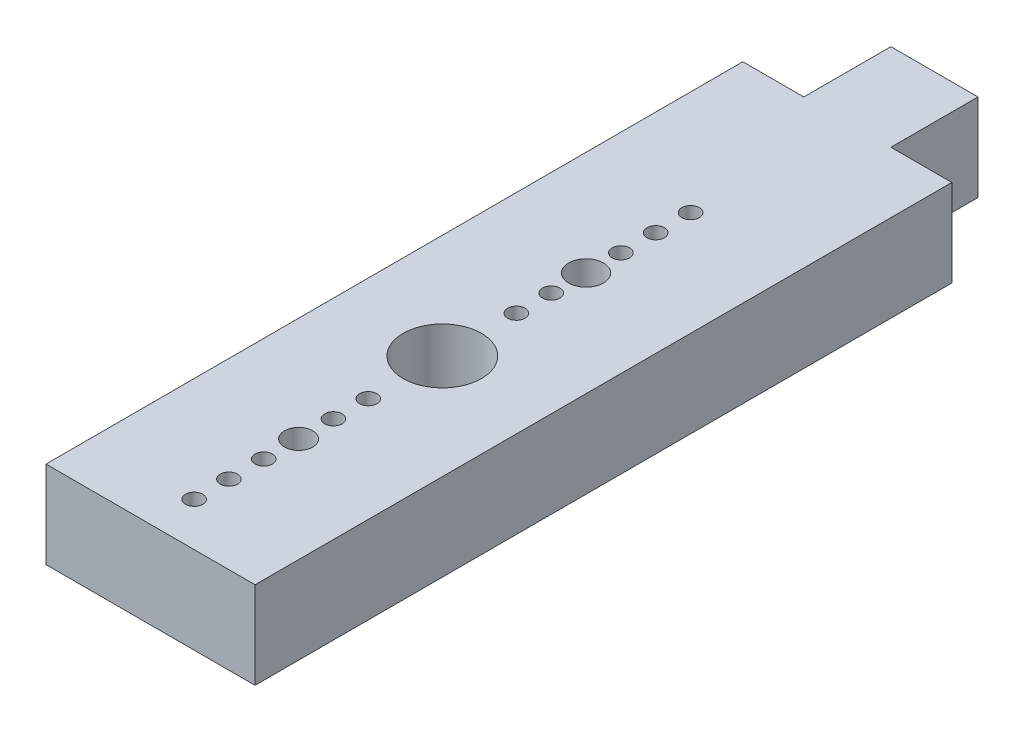
ISO-10303-21;
HEADER;
FILE_DESCRIPTION(('STEP AP214'),'2;1');
FILE_NAME('part.step','',(''),(''),'','','');
FILE_SCHEMA(('AUTOMOTIVE_DESIGN { 1 0 10303 214 1 1 1 1 }'));
ENDSEC;
DATA;
#1=APPLICATION_CONTEXT('core data for automotive mechanical design processes');
#2=APPLICATION_PROTOCOL_DEFINITION('international standard','automotive_design',2000,#1);
#3=PRODUCT_CONTEXT('',#1,'mechanical');
#4=PRODUCT('Part','Part','',(#3));
#5=PRODUCT_RELATED_PRODUCT_CATEGORY('part','',(#4));
#6=PRODUCT_DEFINITION_FORMATION('','',#4);
#7=PRODUCT_DEFINITION_CONTEXT('part definition',#1,'design');
#8=PRODUCT_DEFINITION('design','',#6,#7);
#9=PRODUCT_DEFINITION_SHAPE('','',#8);
#10=(LENGTH_UNIT() NAMED_UNIT(*) SI_UNIT(.MILLI.,.METRE.));
#11=(NAMED_UNIT(*) PLANE_ANGLE_UNIT() SI_UNIT($,.RADIAN.));
#12=(NAMED_UNIT(*) SI_UNIT($,.STERADIAN.) SOLID_ANGLE_UNIT());
#13=UNCERTAINTY_MEASURE_WITH_UNIT(LENGTH_MEASURE(1.E-05),#10,'distance_accuracy_value','');
#14=(GEOMETRIC_REPRESENTATION_CONTEXT(3) GLOBAL_UNCERTAINTY_ASSIGNED_CONTEXT((#13)) GLOBAL_UNIT_ASSIGNED_CONTEXT((#10,
#11,#12)) REPRESENTATION_CONTEXT('',''));
#15=CARTESIAN_POINT('',(0.,0.,0.));
#16=DIRECTION('',(0.,0.,1.));
#17=DIRECTION('',(1.,0.,0.));
#18=AXIS2_PLACEMENT_3D('',#15,#16,#17);
#19=CARTESIAN_POINT('',(0.,5.,0.));
#20=DIRECTION('',(0.,1.,0.));
#21=DIRECTION('',(0.,0.,1.));
#22=AXIS2_PLACEMENT_3D('',#19,#20,#21);
#23=PLANE('',#22);
#24=CARTESIAN_POINT('',(1.04744440165294E-13,5.,17.5));
#25=DIRECTION('',(0.,1.,0.));
#26=DIRECTION('',(0.,0.,1.));
#27=AXIS2_PLACEMENT_3D('',#24,#25,#26);
#28=CIRCLE('',#27,0.500000000000001);
#29=CARTESIAN_POINT('',(1.04744440165294E-13,5.,18.));
#30=VERTEX_POINT('',#29);
#31=EDGE_CURVE('E242',#30,#30,#28,.T.);
#32=ORIENTED_EDGE('',*,*,#31,.F.);
#33=EDGE_LOOP('',(#32));
#34=FACE_BOUND('',#33,.T.);
#35=CARTESIAN_POINT('',(0.,5.,13.5));
#36=DIRECTION('',(0.,1.,0.));
#37=DIRECTION('',(0.,0.,1.));
#38=AXIS2_PLACEMENT_3D('',#35,#36,#37);
#39=CIRCLE('',#38,0.500000000000001);
#40=CARTESIAN_POINT('',(0.,5.,14.));
#41=VERTEX_POINT('',#40);
#42=EDGE_CURVE('E230',#41,#41,#39,.T.);
#43=ORIENTED_EDGE('',*,*,#42,.F.);
#44=EDGE_LOOP('',(#43));
#45=FACE_BOUND('',#44,.T.);
#46=CARTESIAN_POINT('',(0.,5.,9.5));
#47=DIRECTION('',(0.,1.,0.));
#48=DIRECTION('',(0.,0.,1.));
#49=AXIS2_PLACEMENT_3D('',#46,#47,#48);
#50=CIRCLE('',#49,0.500000000000001);
#51=CARTESIAN_POINT('',(0.,5.,10.));
#52=VERTEX_POINT('',#51);
#53=EDGE_CURVE('E218',#52,#52,#50,.T.);
#54=ORIENTED_EDGE('',*,*,#53,.F.);
#55=EDGE_LOOP('',(#54));
#56=FACE_BOUND('',#55,.T.);
#57=CARTESIAN_POINT('',(1.04744440165294E-13,5.,-1.));
#58=DIRECTION('',(0.,1.,0.));
#59=DIRECTION('',(0.,0.,1.));
#60=AXIS2_PLACEMENT_3D('',#57,#58,#59);
#61=CIRCLE('',#60,0.5);
#62=CARTESIAN_POINT('',(1.04744440165294E-13,5.,-0.500000000000001));
#63=VERTEX_POINT('',#62);
#64=EDGE_CURVE('E206',#63,#63,#61,.T.);
#65=ORIENTED_EDGE('',*,*,#64,.F.);
#66=EDGE_LOOP('',(#65));
#67=FACE_BOUND('',#66,.T.);
#68=CARTESIAN_POINT('',(0.,5.,-5.));
#69=DIRECTION('',(0.,1.,0.));
#70=DIRECTION('',(0.,0.,1.));
#71=AXIS2_PLACEMENT_3D('',#68,#69,#70);
#72=CIRCLE('',#71,1.);
#73=CARTESIAN_POINT('',(0.,5.,-4.));
#74=VERTEX_POINT('',#73);
#75=EDGE_CURVE('E194',#74,#74,#72,.T.);
#76=ORIENTED_EDGE('',*,*,#75,.F.);
#77=EDGE_LOOP('',(#76));
#78=FACE_BOUND('',#77,.T.);
#79=CARTESIAN_POINT('',(0.,5.,-9.));
#80=DIRECTION('',(0.,1.,0.));
#81=DIRECTION('',(0.,0.,1.));
#82=AXIS2_PLACEMENT_3D('',#79,#80,#81);
#83=CIRCLE('',#82,0.500000000000001);
#84=CARTESIAN_POINT('',(0.,5.,-8.5));
#85=VERTEX_POINT('',#84);
#86=EDGE_CURVE('E182',#85,#85,#83,.T.);
#87=ORIENTED_EDGE('',*,*,#86,.F.);
#88=EDGE_LOOP('',(#87));
#89=FACE_BOUND('',#88,.T.);
#90=DIRECTION('',(0.,0.,-1.));
#91=VECTOR('',#90,1.);
#92=CARTESIAN_POINT('',(6.,5.,-20.));
#93=LINE('',#92,#91);
#94=CARTESIAN_POINT('',(6.,5.,20.));
#95=VERTEX_POINT('',#94);
#96=CARTESIAN_POINT('',(6.,5.,-20.));
#97=VERTEX_POINT('',#96);
#98=EDGE_CURVE('E145',#95,#97,#93,.T.);
#99=ORIENTED_EDGE('',*,*,#98,.T.);
#100=DIRECTION('',(-1.,0.,0.));
#101=VECTOR('',#100,1.);
#102=CARTESIAN_POINT('',(2.5,5.,-20.));
#103=LINE('',#102,#101);
#104=CARTESIAN_POINT('',(2.5,5.,-20.));
#105=VERTEX_POINT('',#104);
#106=EDGE_CURVE('E93',#97,#105,#103,.T.);
#107=ORIENTED_EDGE('',*,*,#106,.T.);
#108=DIRECTION('',(0.,0.,-1.));
#109=VECTOR('',#108,1.);
#110=CARTESIAN_POINT('',(2.5,5.,-25.));
#111=LINE('',#110,#109);
#112=CARTESIAN_POINT('',(2.5,5.,-25.));
#113=VERTEX_POINT('',#112);
#114=EDGE_CURVE('E160',#105,#113,#111,.T.);
#115=ORIENTED_EDGE('',*,*,#114,.T.);
#116=DIRECTION('',(-1.,0.,0.));
#117=VECTOR('',#116,1.);
#118=CARTESIAN_POINT('',(-2.5,5.,-25.));
#119=LINE('',#118,#117);
#120=CARTESIAN_POINT('',(-2.5,5.,-25.));
#121=VERTEX_POINT('',#120);
#122=EDGE_CURVE('E173',#113,#121,#119,.T.);
#123=ORIENTED_EDGE('',*,*,#122,.T.);
#124=DIRECTION('',(0.,0.,1.));
#125=VECTOR('',#124,1.);
#126=CARTESIAN_POINT('',(-2.5,5.,-20.));
#127=LINE('',#126,#125);
#128=CARTESIAN_POINT('',(-2.5,5.,-20.));
#129=VERTEX_POINT('',#128);
#130=EDGE_CURVE('E112',#121,#129,#127,.T.);
#131=ORIENTED_EDGE('',*,*,#130,.T.);
#132=DIRECTION('',(-1.,0.,0.));
#133=VECTOR('',#132,1.);
#134=CARTESIAN_POINT('',(-6.,5.,-20.));
#135=LINE('',#134,#133);
#136=CARTESIAN_POINT('',(-6.,5.,-20.));
#137=VERTEX_POINT('',#136);
#138=EDGE_CURVE('E106',#129,#137,#135,.T.);
#139=ORIENTED_EDGE('',*,*,#138,.T.);
#140=DIRECTION('',(0.,0.,1.));
#141=VECTOR('',#140,1.);
#142=CARTESIAN_POINT('',(-6.,5.,-20.));
#143=LINE('',#142,#141);
#144=CARTESIAN_POINT('',(-6.,5.,20.));
#145=VERTEX_POINT('',#144);
#146=EDGE_CURVE('E110',#137,#145,#143,.T.);
#147=ORIENTED_EDGE('',*,*,#146,.T.);
#148=DIRECTION('',(1.,0.,0.));
#149=VECTOR('',#148,1.);
#150=CARTESIAN_POINT('',(-6.,5.,20.));
#151=LINE('',#150,#149);
#152=EDGE_CURVE('E50',#145,#95,#151,.T.);
#153=ORIENTED_EDGE('',*,*,#152,.T.);
#154=EDGE_LOOP('',(#99,#107,#115,#123,#131,#139,#147,#153));
#155=FACE_BOUND('',#154,.T.);
#156=CARTESIAN_POINT('',(0.,5.,-11.));
#157=DIRECTION('',(0.,1.,0.));
#158=DIRECTION('',(0.,0.,1.));
#159=AXIS2_PLACEMENT_3D('',#156,#157,#158);
#160=CIRCLE('',#159,0.500000000000001);
#161=CARTESIAN_POINT('',(0.,5.,-10.5));
#162=VERTEX_POINT('',#161);
#163=EDGE_CURVE('E134',#162,#162,#160,.T.);
#164=ORIENTED_EDGE('',*,*,#163,.F.);
#165=EDGE_LOOP('',(#164));
#166=FACE_BOUND('',#165,.T.);
#167=CARTESIAN_POINT('',(0.,5.,-7.));
#168=DIRECTION('',(0.,1.,0.));
#169=DIRECTION('',(0.,0.,1.));
#170=AXIS2_PLACEMENT_3D('',#167,#168,#169);
#171=CIRCLE('',#170,0.500000000000001);
#172=CARTESIAN_POINT('',(0.,5.,-6.5));
#173=VERTEX_POINT('',#172);
#174=EDGE_CURVE('E188',#173,#173,#171,.T.);
#175=ORIENTED_EDGE('',*,*,#174,.F.);
#176=EDGE_LOOP('',(#175));
#177=FACE_BOUND('',#176,.T.);
#178=CARTESIAN_POINT('',(0.,5.,-3.));
#179=DIRECTION('',(0.,1.,0.));
#180=DIRECTION('',(0.,0.,1.));
#181=AXIS2_PLACEMENT_3D('',#178,#179,#180);
#182=CIRCLE('',#181,0.500000000000001);
#183=CARTESIAN_POINT('',(0.,5.,-2.5));
#184=VERTEX_POINT('',#183);
#185=EDGE_CURVE('E200',#184,#184,#182,.T.);
#186=ORIENTED_EDGE('',*,*,#185,.F.);
#187=EDGE_LOOP('',(#186));
#188=FACE_BOUND('',#187,.T.);
#189=CARTESIAN_POINT('',(0.,5.,7.5));
#190=DIRECTION('',(0.,1.,0.));
#191=DIRECTION('',(0.,0.,1.));
#192=AXIS2_PLACEMENT_3D('',#189,#190,#191);
#193=CIRCLE('',#192,0.500000000000001);
#194=CARTESIAN_POINT('',(0.,5.,8.));
#195=VERTEX_POINT('',#194);
#196=EDGE_CURVE('E212',#195,#195,#193,.T.);
#197=ORIENTED_EDGE('',*,*,#196,.F.);
#198=EDGE_LOOP('',(#197));
#199=FACE_BOUND('',#198,.T.);
#200=CARTESIAN_POINT('',(0.,5.,11.5));
#201=DIRECTION('',(0.,1.,0.));
#202=DIRECTION('',(0.,0.,1.));
#203=AXIS2_PLACEMENT_3D('',#200,#201,#202);
#204=CIRCLE('',#203,0.811190326310554);
#205=CARTESIAN_POINT('',(0.,5.,12.3111903263106));
#206=VERTEX_POINT('',#205);
#207=EDGE_CURVE('E224',#206,#206,#204,.T.);
#208=ORIENTED_EDGE('',*,*,#207,.F.);
#209=EDGE_LOOP('',(#208));
#210=FACE_BOUND('',#209,.T.);
#211=CARTESIAN_POINT('',(0.,5.,15.5));
#212=DIRECTION('',(0.,1.,0.));
#213=DIRECTION('',(0.,0.,1.));
#214=AXIS2_PLACEMENT_3D('',#211,#212,#213);
#215=CIRCLE('',#214,0.500000000000001);
#216=CARTESIAN_POINT('',(0.,5.,16.));
#217=VERTEX_POINT('',#216);
#218=EDGE_CURVE('E236',#217,#217,#215,.T.);
#219=ORIENTED_EDGE('',*,*,#218,.F.);
#220=EDGE_LOOP('',(#219));
#221=FACE_BOUND('',#220,.T.);
#222=CARTESIAN_POINT('',(0.,5.,3.25));
#223=DIRECTION('',(0.,1.,0.));
#224=DIRECTION('',(0.,0.,1.));
#225=AXIS2_PLACEMENT_3D('',#222,#223,#224);
#226=CIRCLE('',#225,2.25);
#227=CARTESIAN_POINT('',(0.,5.,5.5));
#228=VERTEX_POINT('',#227);
#229=EDGE_CURVE('E248',#228,#228,#226,.T.);
#230=ORIENTED_EDGE('',*,*,#229,.F.);
#231=EDGE_LOOP('',(#230));
#232=FACE_BOUND('',#231,.T.);
#233=ADVANCED_FACE('F33',(#34,#45,#56,#67,#78,#89,#155,#166,#177,#188,#199,#210,#221,#232),#23,.T.);
#234=CARTESIAN_POINT('',(0.,0.,0.));
#235=DIRECTION('',(0.,1.,0.));
#236=DIRECTION('',(0.,0.,1.));
#237=AXIS2_PLACEMENT_3D('',#234,#235,#236);
#238=PLANE('',#237);
#239=DIRECTION('',(0.,0.,-1.));
#240=VECTOR('',#239,1.);
#241=CARTESIAN_POINT('',(6.,0.,-20.));
#242=LINE('',#241,#240);
#243=CARTESIAN_POINT('',(6.,0.,20.));
#244=VERTEX_POINT('',#243);
#245=CARTESIAN_POINT('',(6.,0.,-20.));
#246=VERTEX_POINT('',#245);
#247=EDGE_CURVE('E130',#244,#246,#242,.T.);
#248=ORIENTED_EDGE('',*,*,#247,.F.);
#249=DIRECTION('',(1.,0.,0.));
#250=VECTOR('',#249,1.);
#251=CARTESIAN_POINT('',(-6.,0.,20.));
#252=LINE('',#251,#250);
#253=CARTESIAN_POINT('',(-6.,0.,20.));
#254=VERTEX_POINT('',#253);
#255=EDGE_CURVE('E85',#254,#244,#252,.T.);
#256=ORIENTED_EDGE('',*,*,#255,.F.);
#257=DIRECTION('',(0.,0.,1.));
#258=VECTOR('',#257,1.);
#259=CARTESIAN_POINT('',(-6.,0.,-20.));
#260=LINE('',#259,#258);
#261=CARTESIAN_POINT('',(-6.,0.,-20.));
#262=VERTEX_POINT('',#261);
#263=EDGE_CURVE('E79',#262,#254,#260,.T.);
#264=ORIENTED_EDGE('',*,*,#263,.F.);
#265=DIRECTION('',(-1.,0.,0.));
#266=VECTOR('',#265,1.);
#267=CARTESIAN_POINT('',(-6.,0.,-20.));
#268=LINE('',#267,#266);
#269=CARTESIAN_POINT('',(-2.5,0.,-20.));
#270=VERTEX_POINT('',#269);
#271=EDGE_CURVE('E120',#270,#262,#268,.T.);
#272=ORIENTED_EDGE('',*,*,#271,.F.);
#273=DIRECTION('',(0.,0.,1.));
#274=VECTOR('',#273,1.);
#275=CARTESIAN_POINT('',(-2.5,0.,-20.));
#276=LINE('',#275,#274);
#277=CARTESIAN_POINT('',(-2.5,0.,-25.));
#278=VERTEX_POINT('',#277);
#279=EDGE_CURVE('E140',#278,#270,#276,.T.);
#280=ORIENTED_EDGE('',*,*,#279,.F.);
#281=DIRECTION('',(-1.,0.,0.));
#282=VECTOR('',#281,1.);
#283=CARTESIAN_POINT('',(-2.5,0.,-25.));
#284=LINE('',#283,#282);
#285=CARTESIAN_POINT('',(2.5,0.,-25.));
#286=VERTEX_POINT('',#285);
#287=EDGE_CURVE('E138',#286,#278,#284,.T.);
#288=ORIENTED_EDGE('',*,*,#287,.F.);
#289=DIRECTION('',(0.,0.,-1.));
#290=VECTOR('',#289,1.);
#291=CARTESIAN_POINT('',(2.5,0.,-25.));
#292=LINE('',#291,#290);
#293=CARTESIAN_POINT('',(2.5,0.,-20.));
#294=VERTEX_POINT('',#293);
#295=EDGE_CURVE('E136',#294,#286,#292,.T.);
#296=ORIENTED_EDGE('',*,*,#295,.F.);
#297=DIRECTION('',(-1.,0.,0.));
#298=VECTOR('',#297,1.);
#299=CARTESIAN_POINT('',(2.5,0.,-20.));
#300=LINE('',#299,#298);
#301=EDGE_CURVE('E133',#246,#294,#300,.T.);
#302=ORIENTED_EDGE('',*,*,#301,.F.);
#303=EDGE_LOOP('',(#248,#256,#264,#272,#280,#288,#296,#302));
#304=FACE_BOUND('',#303,.T.);
#305=CARTESIAN_POINT('',(0.,0.,-11.));
#306=DIRECTION('',(0.,1.,0.));
#307=DIRECTION('',(0.,0.,1.));
#308=AXIS2_PLACEMENT_3D('',#305,#306,#307);
#309=CIRCLE('',#308,0.500000000000001);
#310=CARTESIAN_POINT('',(0.,0.,-10.5));
#311=VERTEX_POINT('',#310);
#312=EDGE_CURVE('E179',#311,#311,#309,.T.);
#313=ORIENTED_EDGE('',*,*,#312,.T.);
#314=EDGE_LOOP('',(#313));
#315=FACE_BOUND('',#314,.T.);
#316=CARTESIAN_POINT('',(0.,0.,-9.));
#317=DIRECTION('',(0.,1.,0.));
#318=DIRECTION('',(0.,0.,1.));
#319=AXIS2_PLACEMENT_3D('',#316,#317,#318);
#320=CIRCLE('',#319,0.500000000000001);
#321=CARTESIAN_POINT('',(0.,0.,-8.5));
#322=VERTEX_POINT('',#321);
#323=EDGE_CURVE('E185',#322,#322,#320,.T.);
#324=ORIENTED_EDGE('',*,*,#323,.T.);
#325=EDGE_LOOP('',(#324));
#326=FACE_BOUND('',#325,.T.);
#327=CARTESIAN_POINT('',(0.,0.,-7.));
#328=DIRECTION('',(0.,1.,0.));
#329=DIRECTION('',(0.,0.,1.));
#330=AXIS2_PLACEMENT_3D('',#327,#328,#329);
#331=CIRCLE('',#330,0.500000000000001);
#332=CARTESIAN_POINT('',(0.,0.,-6.5));
#333=VERTEX_POINT('',#332);
#334=EDGE_CURVE('E191',#333,#333,#331,.T.);
#335=ORIENTED_EDGE('',*,*,#334,.T.);
#336=EDGE_LOOP('',(#335));
#337=FACE_BOUND('',#336,.T.);
#338=CARTESIAN_POINT('',(0.,0.,-5.));
#339=DIRECTION('',(0.,1.,0.));
#340=DIRECTION('',(0.,0.,1.));
#341=AXIS2_PLACEMENT_3D('',#338,#339,#340);
#342=CIRCLE('',#341,1.);
#343=CARTESIAN_POINT('',(0.,0.,-4.));
#344=VERTEX_POINT('',#343);
#345=EDGE_CURVE('E197',#344,#344,#342,.T.);
#346=ORIENTED_EDGE('',*,*,#345,.T.);
#347=EDGE_LOOP('',(#346));
#348=FACE_BOUND('',#347,.T.);
#349=CARTESIAN_POINT('',(0.,0.,-3.));
#350=DIRECTION('',(0.,1.,0.));
#351=DIRECTION('',(0.,0.,1.));
#352=AXIS2_PLACEMENT_3D('',#349,#350,#351);
#353=CIRCLE('',#352,0.500000000000001);
#354=CARTESIAN_POINT('',(0.,0.,-2.5));
#355=VERTEX_POINT('',#354);
#356=EDGE_CURVE('E203',#355,#355,#353,.T.);
#357=ORIENTED_EDGE('',*,*,#356,.T.);
#358=EDGE_LOOP('',(#357));
#359=FACE_BOUND('',#358,.T.);
#360=CARTESIAN_POINT('',(1.04744440165294E-13,0.,-1.));
#361=DIRECTION('',(0.,1.,0.));
#362=DIRECTION('',(0.,0.,1.));
#363=AXIS2_PLACEMENT_3D('',#360,#361,#362);
#364=CIRCLE('',#363,0.5);
#365=CARTESIAN_POINT('',(1.04744440165294E-13,0.,-0.500000000000001));
#366=VERTEX_POINT('',#365);
#367=EDGE_CURVE('E209',#366,#366,#364,.T.);
#368=ORIENTED_EDGE('',*,*,#367,.T.);
#369=EDGE_LOOP('',(#368));
#370=FACE_BOUND('',#369,.T.);
#371=CARTESIAN_POINT('',(0.,0.,7.5));
#372=DIRECTION('',(0.,1.,0.));
#373=DIRECTION('',(0.,0.,1.));
#374=AXIS2_PLACEMENT_3D('',#371,#372,#373);
#375=CIRCLE('',#374,0.500000000000001);
#376=CARTESIAN_POINT('',(0.,0.,8.));
#377=VERTEX_POINT('',#376);
#378=EDGE_CURVE('E215',#377,#377,#375,.T.);
#379=ORIENTED_EDGE('',*,*,#378,.T.);
#380=EDGE_LOOP('',(#379));
#381=FACE_BOUND('',#380,.T.);
#382=CARTESIAN_POINT('',(0.,0.,9.5));
#383=DIRECTION('',(0.,1.,0.));
#384=DIRECTION('',(0.,0.,1.));
#385=AXIS2_PLACEMENT_3D('',#382,#383,#384);
#386=CIRCLE('',#385,0.500000000000001);
#387=CARTESIAN_POINT('',(0.,0.,10.));
#388=VERTEX_POINT('',#387);
#389=EDGE_CURVE('E221',#388,#388,#386,.T.);
#390=ORIENTED_EDGE('',*,*,#389,.T.);
#391=EDGE_LOOP('',(#390));
#392=FACE_BOUND('',#391,.T.);
#393=CARTESIAN_POINT('',(0.,0.,11.5));
#394=DIRECTION('',(0.,1.,0.));
#395=DIRECTION('',(0.,0.,1.));
#396=AXIS2_PLACEMENT_3D('',#393,#394,#395);
#397=CIRCLE('',#396,0.811190326310554);
#398=CARTESIAN_POINT('',(0.,0.,12.3111903263106));
#399=VERTEX_POINT('',#398);
#400=EDGE_CURVE('E227',#399,#399,#397,.T.);
#401=ORIENTED_EDGE('',*,*,#400,.T.);
#402=EDGE_LOOP('',(#401));
#403=FACE_BOUND('',#402,.T.);
#404=CARTESIAN_POINT('',(0.,0.,13.5));
#405=DIRECTION('',(0.,1.,0.));
#406=DIRECTION('',(0.,0.,1.));
#407=AXIS2_PLACEMENT_3D('',#404,#405,#406);
#408=CIRCLE('',#407,0.500000000000001);
#409=CARTESIAN_POINT('',(0.,0.,14.));
#410=VERTEX_POINT('',#409);
#411=EDGE_CURVE('E233',#410,#410,#408,.T.);
#412=ORIENTED_EDGE('',*,*,#411,.T.);
#413=EDGE_LOOP('',(#412));
#414=FACE_BOUND('',#413,.T.);
#415=CARTESIAN_POINT('',(0.,0.,15.5));
#416=DIRECTION('',(0.,1.,0.));
#417=DIRECTION('',(0.,0.,1.));
#418=AXIS2_PLACEMENT_3D('',#415,#416,#417);
#419=CIRCLE('',#418,0.500000000000001);
#420=CARTESIAN_POINT('',(0.,0.,16.));
#421=VERTEX_POINT('',#420);
#422=EDGE_CURVE('E239',#421,#421,#419,.T.);
#423=ORIENTED_EDGE('',*,*,#422,.T.);
#424=EDGE_LOOP('',(#423));
#425=FACE_BOUND('',#424,.T.);
#426=CARTESIAN_POINT('',(1.04744440165294E-13,0.,17.5));
#427=DIRECTION('',(0.,1.,0.));
#428=DIRECTION('',(0.,0.,1.));
#429=AXIS2_PLACEMENT_3D('',#426,#427,#428);
#430=CIRCLE('',#429,0.500000000000001);
#431=CARTESIAN_POINT('',(1.04744440165294E-13,0.,18.));
#432=VERTEX_POINT('',#431);
#433=EDGE_CURVE('E245',#432,#432,#430,.T.);
#434=ORIENTED_EDGE('',*,*,#433,.T.);
#435=EDGE_LOOP('',(#434));
#436=FACE_BOUND('',#435,.T.);
#437=CARTESIAN_POINT('',(0.,0.,3.25));
#438=DIRECTION('',(0.,1.,0.));
#439=DIRECTION('',(0.,0.,1.));
#440=AXIS2_PLACEMENT_3D('',#437,#438,#439);
#441=CIRCLE('',#440,2.25);
#442=CARTESIAN_POINT('',(0.,0.,5.5));
#443=VERTEX_POINT('',#442);
#444=EDGE_CURVE('E251',#443,#443,#441,.T.);
#445=ORIENTED_EDGE('',*,*,#444,.T.);
#446=EDGE_LOOP('',(#445));
#447=FACE_BOUND('',#446,.T.);
#448=ADVANCED_FACE('F164',(#304,#315,#326,#337,#348,#359,#370,#381,#392,#403,#414,#425,#436,
#447),#238,.F.);
#449=CARTESIAN_POINT('',(6.,5.,-20.));
#450=DIRECTION('',(-1.,0.,0.));
#451=DIRECTION('',(0.,0.,1.));
#452=AXIS2_PLACEMENT_3D('',#449,#450,#451);
#453=PLANE('',#452);
#454=ORIENTED_EDGE('',*,*,#247,.T.);
#455=DIRECTION('',(0.,-1.,0.));
#456=VECTOR('',#455,1.);
#457=CARTESIAN_POINT('',(6.,5.,-20.));
#458=LINE('',#457,#456);
#459=EDGE_CURVE('E11',#97,#246,#458,.T.);
#460=ORIENTED_EDGE('',*,*,#459,.F.);
#461=ORIENTED_EDGE('',*,*,#98,.F.);
#462=DIRECTION('',(0.,-1.,0.));
#463=VECTOR('',#462,1.);
#464=CARTESIAN_POINT('',(6.,5.,20.));
#465=LINE('',#464,#463);
#466=EDGE_CURVE('E126',#95,#244,#465,.T.);
#467=ORIENTED_EDGE('',*,*,#466,.T.);
#468=EDGE_LOOP('',(#454,#460,#461,#467));
#469=FACE_BOUND('',#468,.T.);
#470=ADVANCED_FACE('F35',(#469),#453,.F.);
#471=CARTESIAN_POINT('',(2.5,5.,-20.));
#472=DIRECTION('',(0.,0.,1.));
#473=DIRECTION('',(1.,0.,0.));
#474=AXIS2_PLACEMENT_3D('',#471,#472,#473);
#475=PLANE('',#474);
#476=ORIENTED_EDGE('',*,*,#301,.T.);
#477=DIRECTION('',(0.,-1.,0.));
#478=VECTOR('',#477,1.);
#479=CARTESIAN_POINT('',(2.5,5.,-20.));
#480=LINE('',#479,#478);
#481=EDGE_CURVE('E42',#105,#294,#480,.T.);
#482=ORIENTED_EDGE('',*,*,#481,.F.);
#483=ORIENTED_EDGE('',*,*,#106,.F.);
#484=ORIENTED_EDGE('',*,*,#459,.T.);
#485=EDGE_LOOP('',(#476,#482,#483,#484));
#486=FACE_BOUND('',#485,.T.);
#487=ADVANCED_FACE('F285',(#486),#475,.F.);
#488=CARTESIAN_POINT('',(2.5,5.,-25.));
#489=DIRECTION('',(-1.,0.,0.));
#490=DIRECTION('',(0.,0.,1.));
#491=AXIS2_PLACEMENT_3D('',#488,#489,#490);
#492=PLANE('',#491);
#493=ORIENTED_EDGE('',*,*,#295,.T.);
#494=DIRECTION('',(0.,-1.,0.));
#495=VECTOR('',#494,1.);
#496=CARTESIAN_POINT('',(2.5,5.,-25.));
#497=LINE('',#496,#495);
#498=EDGE_CURVE('E152',#113,#286,#497,.T.);
#499=ORIENTED_EDGE('',*,*,#498,.F.);
#500=ORIENTED_EDGE('',*,*,#114,.F.);
#501=ORIENTED_EDGE('',*,*,#481,.T.);
#502=EDGE_LOOP('',(#493,#499,#500,#501));
#503=FACE_BOUND('',#502,.T.);
#504=ADVANCED_FACE('F158',(#503),#492,.F.);
#505=CARTESIAN_POINT('',(-2.5,5.,-25.));
#506=DIRECTION('',(0.,0.,1.));
#507=DIRECTION('',(1.,0.,0.));
#508=AXIS2_PLACEMENT_3D('',#505,#506,#507);
#509=PLANE('',#508);
#510=ORIENTED_EDGE('',*,*,#287,.T.);
#511=DIRECTION('',(0.,-1.,0.));
#512=VECTOR('',#511,1.);
#513=CARTESIAN_POINT('',(-2.5,5.,-25.));
#514=LINE('',#513,#512);
#515=EDGE_CURVE('E149',#121,#278,#514,.T.);
#516=ORIENTED_EDGE('',*,*,#515,.F.);
#517=ORIENTED_EDGE('',*,*,#122,.F.);
#518=ORIENTED_EDGE('',*,*,#498,.T.);
#519=EDGE_LOOP('',(#510,#516,#517,#518));
#520=FACE_BOUND('',#519,.T.);
#521=ADVANCED_FACE('F169',(#520),#509,.F.);
#522=CARTESIAN_POINT('',(-2.5,5.,-20.));
#523=DIRECTION('',(1.,0.,0.));
#524=DIRECTION('',(0.,0.,-1.));
#525=AXIS2_PLACEMENT_3D('',#522,#523,#524);
#526=PLANE('',#525);
#527=ORIENTED_EDGE('',*,*,#279,.T.);
#528=DIRECTION('',(0.,-1.,0.));
#529=VECTOR('',#528,1.);
#530=CARTESIAN_POINT('',(-2.5,5.,-20.));
#531=LINE('',#530,#529);
#532=EDGE_CURVE('E121',#129,#270,#531,.T.);
#533=ORIENTED_EDGE('',*,*,#532,.F.);
#534=ORIENTED_EDGE('',*,*,#130,.F.);
#535=ORIENTED_EDGE('',*,*,#515,.T.);
#536=EDGE_LOOP('',(#527,#533,#534,#535));
#537=FACE_BOUND('',#536,.T.);
#538=ADVANCED_FACE('F172',(#537),#526,.F.);
#539=CARTESIAN_POINT('',(-6.,5.,-20.));
#540=DIRECTION('',(0.,0.,1.));
#541=DIRECTION('',(1.,0.,0.));
#542=AXIS2_PLACEMENT_3D('',#539,#540,#541);
#543=PLANE('',#542);
#544=ORIENTED_EDGE('',*,*,#271,.T.);
#545=DIRECTION('',(0.,-1.,0.));
#546=VECTOR('',#545,1.);
#547=CARTESIAN_POINT('',(-6.,5.,-20.));
#548=LINE('',#547,#546);
#549=EDGE_CURVE('E117',#137,#262,#548,.T.);
#550=ORIENTED_EDGE('',*,*,#549,.F.);
#551=ORIENTED_EDGE('',*,*,#138,.F.);
#552=ORIENTED_EDGE('',*,*,#532,.T.);
#553=EDGE_LOOP('',(#544,#550,#551,#552));
#554=FACE_BOUND('',#553,.T.);
#555=ADVANCED_FACE('F118',(#554),#543,.F.);
#556=CARTESIAN_POINT('',(-6.,5.,-20.));
#557=DIRECTION('',(1.,0.,0.));
#558=DIRECTION('',(0.,0.,-1.));
#559=AXIS2_PLACEMENT_3D('',#556,#557,#558);
#560=PLANE('',#559);
#561=ORIENTED_EDGE('',*,*,#263,.T.);
#562=DIRECTION('',(0.,-1.,0.));
#563=VECTOR('',#562,1.);
#564=CARTESIAN_POINT('',(-6.,5.,20.));
#565=LINE('',#564,#563);
#566=EDGE_CURVE('E122',#145,#254,#565,.T.);
#567=ORIENTED_EDGE('',*,*,#566,.F.);
#568=ORIENTED_EDGE('',*,*,#146,.F.);
#569=ORIENTED_EDGE('',*,*,#549,.T.);
#570=EDGE_LOOP('',(#561,#567,#568,#569));
#571=FACE_BOUND('',#570,.T.);
#572=ADVANCED_FACE('F124',(#571),#560,.F.);
#573=CARTESIAN_POINT('',(-6.,5.,20.));
#574=DIRECTION('',(0.,0.,-1.));
#575=DIRECTION('',(-1.,0.,0.));
#576=AXIS2_PLACEMENT_3D('',#573,#574,#575);
#577=PLANE('',#576);
#578=ORIENTED_EDGE('',*,*,#255,.T.);
#579=ORIENTED_EDGE('',*,*,#466,.F.);
#580=ORIENTED_EDGE('',*,*,#152,.F.);
#581=ORIENTED_EDGE('',*,*,#566,.T.);
#582=EDGE_LOOP('',(#578,#579,#580,#581));
#583=FACE_BOUND('',#582,.T.);
#584=ADVANCED_FACE('F273',(#583),#577,.F.);
#585=CARTESIAN_POINT('',(0.,5.,-11.));
#586=DIRECTION('',(0.,-1.,0.));
#587=DIRECTION('',(0.,0.,-1.));
#588=AXIS2_PLACEMENT_3D('',#585,#586,#587);
#589=CYLINDRICAL_SURFACE('',#588,0.500000000000001);
#590=ORIENTED_EDGE('',*,*,#163,.T.);
#591=EDGE_LOOP('',(#590));
#592=FACE_BOUND('',#591,.T.);
#593=ORIENTED_EDGE('',*,*,#312,.F.);
#594=EDGE_LOOP('',(#593));
#595=FACE_BOUND('',#594,.T.);
#596=ADVANCED_FACE('F270',(#592,#595),#589,.F.);
#597=CARTESIAN_POINT('',(0.,5.,-9.));
#598=DIRECTION('',(0.,-1.,0.));
#599=DIRECTION('',(0.,0.,-1.));
#600=AXIS2_PLACEMENT_3D('',#597,#598,#599);
#601=CYLINDRICAL_SURFACE('',#600,0.500000000000001);
#602=ORIENTED_EDGE('',*,*,#86,.T.);
#603=EDGE_LOOP('',(#602));
#604=FACE_BOUND('',#603,.T.);
#605=ORIENTED_EDGE('',*,*,#323,.F.);
#606=EDGE_LOOP('',(#605));
#607=FACE_BOUND('',#606,.T.);
#608=ADVANCED_FACE('F349',(#604,#607),#601,.F.);
#609=CARTESIAN_POINT('',(0.,5.,-7.));
#610=DIRECTION('',(0.,-1.,0.));
#611=DIRECTION('',(0.,0.,-1.));
#612=AXIS2_PLACEMENT_3D('',#609,#610,#611);
#613=CYLINDRICAL_SURFACE('',#612,0.500000000000001);
#614=ORIENTED_EDGE('',*,*,#174,.T.);
#615=EDGE_LOOP('',(#614));
#616=FACE_BOUND('',#615,.T.);
#617=ORIENTED_EDGE('',*,*,#334,.F.);
#618=EDGE_LOOP('',(#617));
#619=FACE_BOUND('',#618,.T.);
#620=ADVANCED_FACE('F357',(#616,#619),#613,.F.);
#621=CARTESIAN_POINT('',(0.,5.,-5.));
#622=DIRECTION('',(0.,-1.,0.));
#623=DIRECTION('',(0.,0.,-1.));
#624=AXIS2_PLACEMENT_3D('',#621,#622,#623);
#625=CYLINDRICAL_SURFACE('',#624,1.);
#626=ORIENTED_EDGE('',*,*,#75,.T.);
#627=EDGE_LOOP('',(#626));
#628=FACE_BOUND('',#627,.T.);
#629=ORIENTED_EDGE('',*,*,#345,.F.);
#630=EDGE_LOOP('',(#629));
#631=FACE_BOUND('',#630,.T.);
#632=ADVANCED_FACE('F365',(#628,#631),#625,.F.);
#633=CARTESIAN_POINT('',(0.,5.,-3.));
#634=DIRECTION('',(0.,-1.,0.));
#635=DIRECTION('',(0.,0.,-1.));
#636=AXIS2_PLACEMENT_3D('',#633,#634,#635);
#637=CYLINDRICAL_SURFACE('',#636,0.500000000000001);
#638=ORIENTED_EDGE('',*,*,#185,.T.);
#639=EDGE_LOOP('',(#638));
#640=FACE_BOUND('',#639,.T.);
#641=ORIENTED_EDGE('',*,*,#356,.F.);
#642=EDGE_LOOP('',(#641));
#643=FACE_BOUND('',#642,.T.);
#644=ADVANCED_FACE('F374',(#640,#643),#637,.F.);
#645=CARTESIAN_POINT('',(1.04744440165294E-13,5.,-1.));
#646=DIRECTION('',(0.,-1.,0.));
#647=DIRECTION('',(0.,0.,-1.));
#648=AXIS2_PLACEMENT_3D('',#645,#646,#647);
#649=CYLINDRICAL_SURFACE('',#648,0.5);
#650=ORIENTED_EDGE('',*,*,#64,.T.);
#651=EDGE_LOOP('',(#650));
#652=FACE_BOUND('',#651,.T.);
#653=ORIENTED_EDGE('',*,*,#367,.F.);
#654=EDGE_LOOP('',(#653));
#655=FACE_BOUND('',#654,.T.);
#656=ADVANCED_FACE('F383',(#652,#655),#649,.F.);
#657=CARTESIAN_POINT('',(0.,5.,7.5));
#658=DIRECTION('',(0.,-1.,0.));
#659=DIRECTION('',(0.,0.,-1.));
#660=AXIS2_PLACEMENT_3D('',#657,#658,#659);
#661=CYLINDRICAL_SURFACE('',#660,0.500000000000001);
#662=ORIENTED_EDGE('',*,*,#196,.T.);
#663=EDGE_LOOP('',(#662));
#664=FACE_BOUND('',#663,.T.);
#665=ORIENTED_EDGE('',*,*,#378,.F.);
#666=EDGE_LOOP('',(#665));
#667=FACE_BOUND('',#666,.T.);
#668=ADVANCED_FACE('F392',(#664,#667),#661,.F.);
#669=CARTESIAN_POINT('',(0.,5.,9.5));
#670=DIRECTION('',(0.,-1.,0.));
#671=DIRECTION('',(0.,0.,-1.));
#672=AXIS2_PLACEMENT_3D('',#669,#670,#671);
#673=CYLINDRICAL_SURFACE('',#672,0.500000000000001);
#674=ORIENTED_EDGE('',*,*,#53,.T.);
#675=EDGE_LOOP('',(#674));
#676=FACE_BOUND('',#675,.T.);
#677=ORIENTED_EDGE('',*,*,#389,.F.);
#678=EDGE_LOOP('',(#677));
#679=FACE_BOUND('',#678,.T.);
#680=ADVANCED_FACE('F401',(#676,#679),#673,.F.);
#681=CARTESIAN_POINT('',(0.,5.,11.5));
#682=DIRECTION('',(0.,-1.,0.));
#683=DIRECTION('',(0.,0.,-1.));
#684=AXIS2_PLACEMENT_3D('',#681,#682,#683);
#685=CYLINDRICAL_SURFACE('',#684,0.811190326310554);
#686=ORIENTED_EDGE('',*,*,#207,.T.);
#687=EDGE_LOOP('',(#686));
#688=FACE_BOUND('',#687,.T.);
#689=ORIENTED_EDGE('',*,*,#400,.F.);
#690=EDGE_LOOP('',(#689));
#691=FACE_BOUND('',#690,.T.);
#692=ADVANCED_FACE('F410',(#688,#691),#685,.F.);
#693=CARTESIAN_POINT('',(0.,5.,13.5));
#694=DIRECTION('',(0.,-1.,0.));
#695=DIRECTION('',(0.,0.,-1.));
#696=AXIS2_PLACEMENT_3D('',#693,#694,#695);
#697=CYLINDRICAL_SURFACE('',#696,0.500000000000001);
#698=ORIENTED_EDGE('',*,*,#42,.T.);
#699=EDGE_LOOP('',(#698));
#700=FACE_BOUND('',#699,.T.);
#701=ORIENTED_EDGE('',*,*,#411,.F.);
#702=EDGE_LOOP('',(#701));
#703=FACE_BOUND('',#702,.T.);
#704=ADVANCED_FACE('F419',(#700,#703),#697,.F.);
#705=CARTESIAN_POINT('',(0.,5.,15.5));
#706=DIRECTION('',(0.,-1.,0.));
#707=DIRECTION('',(0.,0.,-1.));
#708=AXIS2_PLACEMENT_3D('',#705,#706,#707);
#709=CYLINDRICAL_SURFACE('',#708,0.500000000000001);
#710=ORIENTED_EDGE('',*,*,#218,.T.);
#711=EDGE_LOOP('',(#710));
#712=FACE_BOUND('',#711,.T.);
#713=ORIENTED_EDGE('',*,*,#422,.F.);
#714=EDGE_LOOP('',(#713));
#715=FACE_BOUND('',#714,.T.);
#716=ADVANCED_FACE('F428',(#712,#715),#709,.F.);
#717=CARTESIAN_POINT('',(1.04744440165294E-13,5.,17.5));
#718=DIRECTION('',(0.,-1.,0.));
#719=DIRECTION('',(0.,0.,-1.));
#720=AXIS2_PLACEMENT_3D('',#717,#718,#719);
#721=CYLINDRICAL_SURFACE('',#720,0.500000000000001);
#722=ORIENTED_EDGE('',*,*,#31,.T.);
#723=EDGE_LOOP('',(#722));
#724=FACE_BOUND('',#723,.T.);
#725=ORIENTED_EDGE('',*,*,#433,.F.);
#726=EDGE_LOOP('',(#725));
#727=FACE_BOUND('',#726,.T.);
#728=ADVANCED_FACE('F437',(#724,#727),#721,.F.);
#729=CARTESIAN_POINT('',(0.,5.,3.25));
#730=DIRECTION('',(0.,-1.,0.));
#731=DIRECTION('',(0.,0.,-1.));
#732=AXIS2_PLACEMENT_3D('',#729,#730,#731);
#733=CYLINDRICAL_SURFACE('',#732,2.25);
#734=ORIENTED_EDGE('',*,*,#229,.T.);
#735=EDGE_LOOP('',(#734));
#736=FACE_BOUND('',#735,.T.);
#737=ORIENTED_EDGE('',*,*,#444,.F.);
#738=EDGE_LOOP('',(#737));
#739=FACE_BOUND('',#738,.T.);
#740=ADVANCED_FACE('F257',(#736,#739),#733,.F.);
#741=CLOSED_SHELL('',(#233,#448,#470,#487,#504,#521,#538,#555,#572,#584,#596,#608,#620,#632,
#644,#656,#668,#680,#692,#704,#716,#728,#740));
#742=MANIFOLD_SOLID_BREP('B2',#741);
#743=ADVANCED_BREP_SHAPE_REPRESENTATION('',(#18,#742),#14);
#744=SHAPE_DEFINITION_REPRESENTATION(#9,#743);
ENDSEC;
END-ISO-10303-21;
